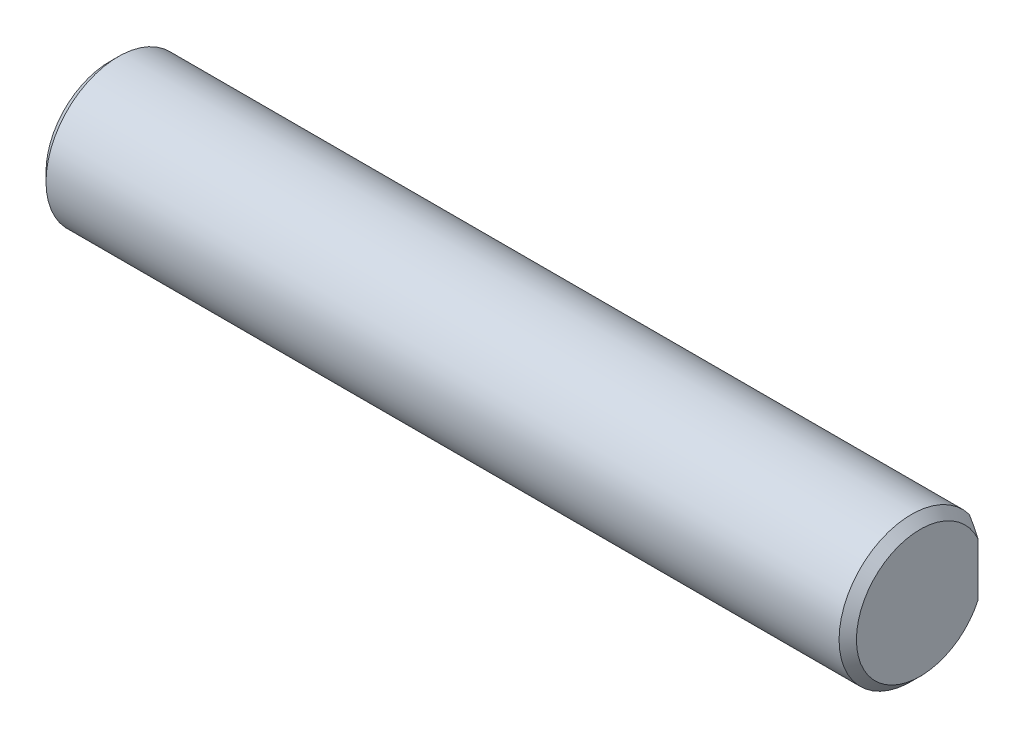
ISO-10303-21;
HEADER;
FILE_DESCRIPTION(('STEP AP214'),'2;1');
FILE_NAME('part.step','',(''),(''),'','','');
FILE_SCHEMA(('AUTOMOTIVE_DESIGN { 1 0 10303 214 1 1 1 1 }'));
ENDSEC;
DATA;
#1=APPLICATION_CONTEXT('core data for automotive mechanical design processes');
#2=APPLICATION_PROTOCOL_DEFINITION('international standard','automotive_design',2000,#1);
#3=PRODUCT_CONTEXT('',#1,'mechanical');
#4=PRODUCT('Part','Part','',(#3));
#5=PRODUCT_RELATED_PRODUCT_CATEGORY('part','',(#4));
#6=PRODUCT_DEFINITION_FORMATION('','',#4);
#7=PRODUCT_DEFINITION_CONTEXT('part definition',#1,'design');
#8=PRODUCT_DEFINITION('design','',#6,#7);
#9=PRODUCT_DEFINITION_SHAPE('','',#8);
#10=(LENGTH_UNIT() NAMED_UNIT(*) SI_UNIT(.MILLI.,.METRE.));
#11=(NAMED_UNIT(*) PLANE_ANGLE_UNIT() SI_UNIT($,.RADIAN.));
#12=(NAMED_UNIT(*) SI_UNIT($,.STERADIAN.) SOLID_ANGLE_UNIT());
#13=UNCERTAINTY_MEASURE_WITH_UNIT(LENGTH_MEASURE(1.E-05),#10,'distance_accuracy_value','');
#14=(GEOMETRIC_REPRESENTATION_CONTEXT(3) GLOBAL_UNCERTAINTY_ASSIGNED_CONTEXT((#13)) GLOBAL_UNIT_ASSIGNED_CONTEXT((#10,
#11,#12)) REPRESENTATION_CONTEXT('',''));
#15=CARTESIAN_POINT('',(0.,0.,0.));
#16=DIRECTION('',(0.,0.,1.));
#17=DIRECTION('',(1.,0.,0.));
#18=AXIS2_PLACEMENT_3D('',#15,#16,#17);
#19=CARTESIAN_POINT('',(-47.5,146.,-3.36675751476492E-12));
#20=DIRECTION('',(1.,0.,0.));
#21=DIRECTION('',(0.,0.,-1.));
#22=AXIS2_PLACEMENT_3D('',#19,#20,#21);
#23=CYLINDRICAL_SURFACE('',#22,2.5);
#24=DIRECTION('',(1.,0.,0.));
#25=VECTOR('',#24,1.);
#26=CARTESIAN_POINT('',(-47.5,147.5,-2.00000000000337));
#27=LINE('',#26,#25);
#28=CARTESIAN_POINT('',(-47.2,147.5,-2.00000000000337));
#29=VERTEX_POINT('',#28);
#30=CARTESIAN_POINT('',(-19.8,147.5,-2.00000000000337));
#31=VERTEX_POINT('',#30);
#32=EDGE_CURVE('E61',#29,#31,#27,.T.);
#33=ORIENTED_EDGE('',*,*,#32,.F.);
#34=CARTESIAN_POINT('',(-47.2,146.,-3.36675751476492E-12));
#35=DIRECTION('',(1.,0.,0.));
#36=DIRECTION('',(0.,0.,-1.));
#37=AXIS2_PLACEMENT_3D('',#34,#35,#36);
#38=CIRCLE('',#37,2.5);
#39=CARTESIAN_POINT('',(-47.2,144.5,-2.00000000000337));
#40=VERTEX_POINT('',#39);
#41=EDGE_CURVE('E72',#29,#40,#38,.T.);
#42=ORIENTED_EDGE('',*,*,#41,.T.);
#43=DIRECTION('',(1.,0.,0.));
#44=VECTOR('',#43,1.);
#45=CARTESIAN_POINT('',(-47.5,144.5,-2.00000000000337));
#46=LINE('',#45,#44);
#47=CARTESIAN_POINT('',(-19.8,144.5,-2.00000000000337));
#48=VERTEX_POINT('',#47);
#49=EDGE_CURVE('E76',#40,#48,#46,.T.);
#50=ORIENTED_EDGE('',*,*,#49,.T.);
#51=CARTESIAN_POINT('',(-19.8,146.,-3.36675751476492E-12));
#52=DIRECTION('',(1.,0.,0.));
#53=DIRECTION('',(0.,0.,-1.));
#54=AXIS2_PLACEMENT_3D('',#51,#52,#53);
#55=CIRCLE('',#54,2.5);
#56=EDGE_CURVE('E74',#48,#31,#55,.F.);
#57=ORIENTED_EDGE('',*,*,#56,.T.);
#58=EDGE_LOOP('',(#33,#42,#50,#57));
#59=FACE_BOUND('',#58,.T.);
#60=ADVANCED_FACE('F16',(#59),#23,.T.);
#61=CARTESIAN_POINT('',(-47.5,146.916515138991,-2.0000000000034));
#62=DIRECTION('',(0.,0.,-1.));
#63=DIRECTION('',(0.,1.,0.));
#64=AXIS2_PLACEMENT_3D('',#61,#62,#63);
#65=PLANE('',#64);
#66=ORIENTED_EDGE('',*,*,#49,.F.);
#67=CARTESIAN_POINT('',(-47.2,144.5,-2.00000000000337));
#68=CARTESIAN_POINT('',(-47.2281606355754,144.546947327346,-2.00000000000346));
#69=CARTESIAN_POINT('',(-47.2557142168574,144.594267852623,-2.0000000000035));
#70=CARTESIAN_POINT('',(-47.3093115689397,144.689673306023,-2.00000000000353));
#71=CARTESIAN_POINT('',(-47.3353572688927,144.737757152447,-2.00000000000351));
#72=CARTESIAN_POINT('',(-47.3857249611438,144.8348426955,-2.0000000000035));
#73=CARTESIAN_POINT('',(-47.4100464916706,144.883844633606,-2.0000000000035));
#74=CARTESIAN_POINT('',(-47.4566498265989,144.982885048178,-2.0000000000035));
#75=CARTESIAN_POINT('',(-47.4789289122746,145.032924800552,-2.0000000000035));
#76=CARTESIAN_POINT('',(-47.5,145.083484861009,-2.00000000000349));
#77=B_SPLINE_CURVE_WITH_KNOTS('',3,(#67,#68,#69,#70,#71,#72,#73,#74,#75,#76),.UNSPECIFIED.,.F.,
.F.,(4,2,2,2,4),(0.,0.16424308684981,0.328271176838181,0.492343032544705,0.656630208197452),.UNSPECIFIED.);
#78=CARTESIAN_POINT('',(-47.5,145.083484861009,-2.0000000000034));
#79=VERTEX_POINT('',#78);
#80=EDGE_CURVE('E39',#40,#79,#77,.T.);
#81=ORIENTED_EDGE('',*,*,#80,.T.);
#82=DIRECTION('',(0.,1.,0.));
#83=VECTOR('',#82,1.);
#84=CARTESIAN_POINT('',(-47.5,144.5,-2.00000000000337));
#85=LINE('',#84,#83);
#86=CARTESIAN_POINT('',(-47.5,146.916515138991,-2.00000000000349));
#87=VERTEX_POINT('',#86);
#88=EDGE_CURVE('E63',#79,#87,#85,.T.);
#89=ORIENTED_EDGE('',*,*,#88,.T.);
#90=CARTESIAN_POINT('',(-47.5,146.916515138991,-2.0000000000035));
#91=CARTESIAN_POINT('',(-47.4789289122746,146.967075199448,-2.00000000000343));
#92=CARTESIAN_POINT('',(-47.456649826599,147.017114951822,-2.0000000000034));
#93=CARTESIAN_POINT('',(-47.4100464916707,147.116155366394,-2.00000000000338));
#94=CARTESIAN_POINT('',(-47.3857249611438,147.1651573045,-2.00000000000338));
#95=CARTESIAN_POINT('',(-47.3353572688928,147.262242847553,-2.00000000000339));
#96=CARTESIAN_POINT('',(-47.3093115689398,147.310326693977,-2.00000000000338));
#97=CARTESIAN_POINT('',(-47.2557142168575,147.405732147377,-2.00000000000337));
#98=CARTESIAN_POINT('',(-47.2281606355754,147.453052672654,-2.00000000000337));
#99=CARTESIAN_POINT('',(-47.2,147.5,-2.00000000000337));
#100=B_SPLINE_CURVE_WITH_KNOTS('',3,(#90,#91,#92,#93,#94,#95,#96,#97,#98,#99),.UNSPECIFIED.,.F.,
.F.,(4,2,2,2,4),(0.,0.164287175652775,0.328359031359265,0.492387121347605,0.656630208197436),.UNSPECIFIED.);
#101=EDGE_CURVE('E58',#87,#29,#100,.T.);
#102=ORIENTED_EDGE('',*,*,#101,.T.);
#103=ORIENTED_EDGE('',*,*,#32,.T.);
#104=CARTESIAN_POINT('',(-19.8,147.5,-2.00000000000337));
#105=CARTESIAN_POINT('',(-19.7718393644246,147.453052672654,-2.00000000000337));
#106=CARTESIAN_POINT('',(-19.7442857831425,147.405732147377,-2.00000000000338));
#107=CARTESIAN_POINT('',(-19.6906884310602,147.310326693977,-2.00000000000338));
#108=CARTESIAN_POINT('',(-19.6646427311072,147.262242847553,-2.00000000000338));
#109=CARTESIAN_POINT('',(-19.6142750388562,147.1651573045,-2.00000000000339));
#110=CARTESIAN_POINT('',(-19.5899535083293,147.116155366394,-2.00000000000339));
#111=CARTESIAN_POINT('',(-19.543350173401,147.017114951822,-2.0000000000034));
#112=CARTESIAN_POINT('',(-19.5210710877254,146.967075199448,-2.0000000000034));
#113=CARTESIAN_POINT('',(-19.5,146.916515138991,-2.0000000000034));
#114=B_SPLINE_CURVE_WITH_KNOTS('',3,(#104,#105,#106,#107,#108,#109,#110,#111,#112,#113),
.UNSPECIFIED.,.F.,.F.,(4,2,2,2,4),(0.,0.164243086849833,0.328271176838172,0.492343032544722,
0.656630208197436),.UNSPECIFIED.);
#115=CARTESIAN_POINT('',(-19.5,146.916515138991,-2.0000000000034));
#116=VERTEX_POINT('',#115);
#117=EDGE_CURVE('E80',#31,#116,#114,.T.);
#118=ORIENTED_EDGE('',*,*,#117,.T.);
#119=DIRECTION('',(0.,1.,0.));
#120=VECTOR('',#119,1.);
#121=CARTESIAN_POINT('',(-19.5,146.916515138991,-2.0000000000034));
#122=LINE('',#121,#120);
#123=CARTESIAN_POINT('',(-19.5,145.083484861009,-2.00000000000349));
#124=VERTEX_POINT('',#123);
#125=EDGE_CURVE('E123',#124,#116,#122,.T.);
#126=ORIENTED_EDGE('',*,*,#125,.F.);
#127=CARTESIAN_POINT('',(-19.5,145.083484861009,-2.0000000000035));
#128=CARTESIAN_POINT('',(-19.5210710877254,145.032924800553,-2.0000000000035));
#129=CARTESIAN_POINT('',(-19.543350173401,144.982885048179,-2.0000000000035));
#130=CARTESIAN_POINT('',(-19.5899535083293,144.883844633607,-2.0000000000035));
#131=CARTESIAN_POINT('',(-19.6142750388562,144.8348426955,-2.0000000000035));
#132=CARTESIAN_POINT('',(-19.6646427311073,144.737757152447,-2.00000000000351));
#133=CARTESIAN_POINT('',(-19.6906884310602,144.689673306023,-2.00000000000351));
#134=CARTESIAN_POINT('',(-19.7442857831426,144.594267852623,-2.00000000000352));
#135=CARTESIAN_POINT('',(-19.7718393644246,144.546947327346,-2.00000000000352));
#136=CARTESIAN_POINT('',(-19.8,144.5,-2.00000000000352));
#137=B_SPLINE_CURVE_WITH_KNOTS('',3,(#127,#128,#129,#130,#131,#132,#133,#134,#135,#136),
.UNSPECIFIED.,.F.,.F.,(4,2,2,2,4),(0.,0.164287175652771,0.328359031359353,0.492387121347787,
0.65663020819763),.UNSPECIFIED.);
#138=EDGE_CURVE('E67',#124,#48,#137,.T.);
#139=ORIENTED_EDGE('',*,*,#138,.T.);
#140=EDGE_LOOP('',(#66,#81,#89,#102,#103,#118,#126,#139));
#141=FACE_BOUND('',#140,.T.);
#142=ADVANCED_FACE('F60',(#141),#65,.T.);
#143=CARTESIAN_POINT('',(-47.5,146.,-3.36675751476492E-12));
#144=DIRECTION('',(1.,0.,0.));
#145=DIRECTION('',(0.,0.,-1.));
#146=AXIS2_PLACEMENT_3D('',#143,#144,#145);
#147=PLANE('',#146);
#148=ORIENTED_EDGE('',*,*,#88,.F.);
#149=CARTESIAN_POINT('',(-47.5,146.,-3.36675751476492E-12));
#150=DIRECTION('',(1.,0.,0.));
#151=DIRECTION('',(0.,0.,-1.));
#152=AXIS2_PLACEMENT_3D('',#149,#150,#151);
#153=CIRCLE('',#152,2.2);
#154=EDGE_CURVE('E27',#79,#87,#153,.F.);
#155=ORIENTED_EDGE('',*,*,#154,.T.);
#156=EDGE_LOOP('',(#148,#155));
#157=FACE_BOUND('',#156,.T.);
#158=ADVANCED_FACE('F100',(#157),#147,.F.);
#159=CARTESIAN_POINT('',(-19.5,146.,-3.36675751476492E-12));
#160=DIRECTION('',(1.,0.,0.));
#161=DIRECTION('',(0.,0.,-1.));
#162=AXIS2_PLACEMENT_3D('',#159,#160,#161);
#163=PLANE('',#162);
#164=ORIENTED_EDGE('',*,*,#125,.T.);
#165=CARTESIAN_POINT('',(-19.5,146.,-3.36675751476492E-12));
#166=DIRECTION('',(1.,0.,0.));
#167=DIRECTION('',(0.,0.,-1.));
#168=AXIS2_PLACEMENT_3D('',#165,#166,#167);
#169=CIRCLE('',#168,2.2);
#170=EDGE_CURVE('E10',#116,#124,#169,.T.);
#171=ORIENTED_EDGE('',*,*,#170,.T.);
#172=EDGE_LOOP('',(#164,#171));
#173=FACE_BOUND('',#172,.T.);
#174=ADVANCED_FACE('F129',(#173),#163,.T.);
#175=CARTESIAN_POINT('',(-47.2,146.,-3.36675751476492E-12));
#176=DIRECTION('',(1.,0.,0.));
#177=DIRECTION('',(0.,0.,-1.));
#178=AXIS2_PLACEMENT_3D('',#175,#176,#177);
#179=CONICAL_SURFACE('',#178,2.5,0.785398163397432);
#180=ORIENTED_EDGE('',*,*,#101,.F.);
#181=ORIENTED_EDGE('',*,*,#154,.F.);
#182=ORIENTED_EDGE('',*,*,#80,.F.);
#183=ORIENTED_EDGE('',*,*,#41,.F.);
#184=EDGE_LOOP('',(#180,#181,#182,#183));
#185=FACE_BOUND('',#184,.T.);
#186=ADVANCED_FACE('F78',(#185),#179,.T.);
#187=CARTESIAN_POINT('',(-19.5,146.,-3.36675751476492E-12));
#188=DIRECTION('',(-1.,0.,0.));
#189=DIRECTION('',(0.,0.,1.));
#190=AXIS2_PLACEMENT_3D('',#187,#188,#189);
#191=CONICAL_SURFACE('',#190,2.2,0.785398163397462);
#192=ORIENTED_EDGE('',*,*,#117,.F.);
#193=ORIENTED_EDGE('',*,*,#56,.F.);
#194=ORIENTED_EDGE('',*,*,#138,.F.);
#195=ORIENTED_EDGE('',*,*,#170,.F.);
#196=EDGE_LOOP('',(#192,#193,#194,#195));
#197=FACE_BOUND('',#196,.T.);
#198=ADVANCED_FACE('F19',(#197),#191,.T.);
#199=CLOSED_SHELL('',(#60,#142,#158,#174,#186,#198));
#200=MANIFOLD_SOLID_BREP('B1',#199);
#201=ADVANCED_BREP_SHAPE_REPRESENTATION('',(#18,#200),#14);
#202=SHAPE_DEFINITION_REPRESENTATION(#9,#201);
ENDSEC;
END-ISO-10303-21;
